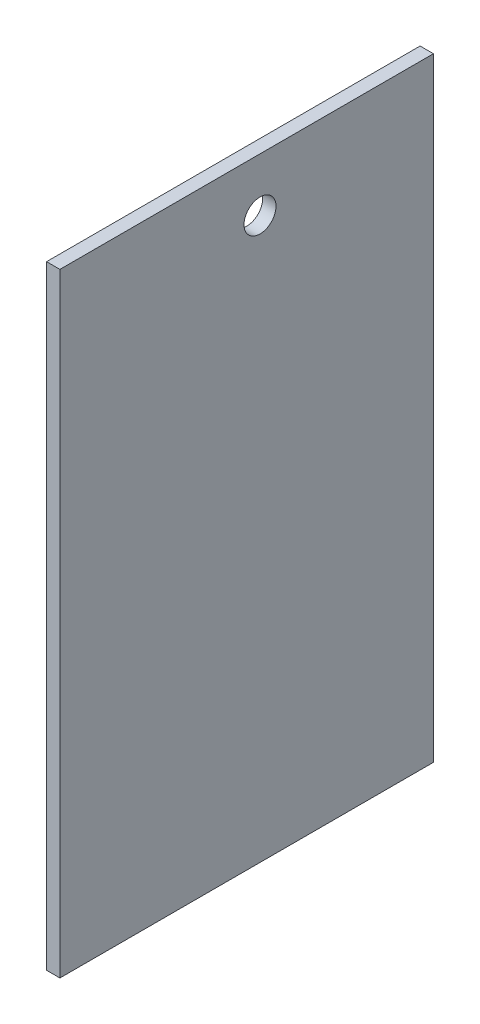
ISO-10303-21;
HEADER;
FILE_DESCRIPTION(('STEP AP214'),'2;1');
FILE_NAME('part.step','',(''),(''),'','','');
FILE_SCHEMA(('AUTOMOTIVE_DESIGN { 1 0 10303 214 1 1 1 1 }'));
ENDSEC;
DATA;
#1=APPLICATION_CONTEXT('core data for automotive mechanical design processes');
#2=APPLICATION_PROTOCOL_DEFINITION('international standard','automotive_design',2000,#1);
#3=PRODUCT_CONTEXT('',#1,'mechanical');
#4=PRODUCT('Part','Part','',(#3));
#5=PRODUCT_RELATED_PRODUCT_CATEGORY('part','',(#4));
#6=PRODUCT_DEFINITION_FORMATION('','',#4);
#7=PRODUCT_DEFINITION_CONTEXT('part definition',#1,'design');
#8=PRODUCT_DEFINITION('design','',#6,#7);
#9=PRODUCT_DEFINITION_SHAPE('','',#8);
#10=(LENGTH_UNIT() NAMED_UNIT(*) SI_UNIT(.MILLI.,.METRE.));
#11=(NAMED_UNIT(*) PLANE_ANGLE_UNIT() SI_UNIT($,.RADIAN.));
#12=(NAMED_UNIT(*) SI_UNIT($,.STERADIAN.) SOLID_ANGLE_UNIT());
#13=UNCERTAINTY_MEASURE_WITH_UNIT(LENGTH_MEASURE(1.E-05),#10,'distance_accuracy_value','');
#14=(GEOMETRIC_REPRESENTATION_CONTEXT(3) GLOBAL_UNCERTAINTY_ASSIGNED_CONTEXT((#13)) GLOBAL_UNIT_ASSIGNED_CONTEXT((#10,
#11,#12)) REPRESENTATION_CONTEXT('',''));
#15=CARTESIAN_POINT('',(0.,0.,0.));
#16=DIRECTION('',(0.,0.,1.));
#17=DIRECTION('',(1.,0.,0.));
#18=AXIS2_PLACEMENT_3D('',#15,#16,#17);
#19=CARTESIAN_POINT('',(3.175,73.025,-44.45));
#20=DIRECTION('',(0.,0.,1.));
#21=DIRECTION('',(0.,-1.,0.));
#22=AXIS2_PLACEMENT_3D('',#19,#20,#21);
#23=PLANE('',#22);
#24=DIRECTION('',(0.,1.,0.));
#25=VECTOR('',#24,1.);
#26=CARTESIAN_POINT('',(0.,73.025,-44.45));
#27=LINE('',#26,#25);
#28=CARTESIAN_POINT('',(0.,-73.025,-44.45));
#29=VERTEX_POINT('',#28);
#30=CARTESIAN_POINT('',(0.,73.025,-44.45));
#31=VERTEX_POINT('',#30);
#32=EDGE_CURVE('E103',#29,#31,#27,.T.);
#33=ORIENTED_EDGE('',*,*,#32,.T.);
#34=DIRECTION('',(-1.,0.,0.));
#35=VECTOR('',#34,1.);
#36=CARTESIAN_POINT('',(3.175,73.025,-44.45));
#37=LINE('',#36,#35);
#38=CARTESIAN_POINT('',(3.175,73.025,-44.45));
#39=VERTEX_POINT('',#38);
#40=EDGE_CURVE('E11',#39,#31,#37,.T.);
#41=ORIENTED_EDGE('',*,*,#40,.F.);
#42=DIRECTION('',(0.,1.,0.));
#43=VECTOR('',#42,1.);
#44=CARTESIAN_POINT('',(3.175,73.025,-44.45));
#45=LINE('',#44,#43);
#46=CARTESIAN_POINT('',(3.175,-73.025,-44.45));
#47=VERTEX_POINT('',#46);
#48=EDGE_CURVE('E91',#47,#39,#45,.T.);
#49=ORIENTED_EDGE('',*,*,#48,.F.);
#50=DIRECTION('',(-1.,0.,0.));
#51=VECTOR('',#50,1.);
#52=CARTESIAN_POINT('',(3.175,-73.025,-44.45));
#53=LINE('',#52,#51);
#54=EDGE_CURVE('E99',#47,#29,#53,.T.);
#55=ORIENTED_EDGE('',*,*,#54,.T.);
#56=EDGE_LOOP('',(#33,#41,#49,#55));
#57=FACE_BOUND('',#56,.T.);
#58=ADVANCED_FACE('F40',(#57),#23,.F.);
#59=CARTESIAN_POINT('',(3.175,73.025,44.45));
#60=DIRECTION('',(0.,-1.,0.));
#61=DIRECTION('',(0.,0.,-1.));
#62=AXIS2_PLACEMENT_3D('',#59,#60,#61);
#63=PLANE('',#62);
#64=DIRECTION('',(0.,0.,1.));
#65=VECTOR('',#64,1.);
#66=CARTESIAN_POINT('',(0.,73.025,44.45));
#67=LINE('',#66,#65);
#68=CARTESIAN_POINT('',(0.,73.025,44.45));
#69=VERTEX_POINT('',#68);
#70=EDGE_CURVE('E95',#31,#69,#67,.T.);
#71=ORIENTED_EDGE('',*,*,#70,.T.);
#72=DIRECTION('',(-1.,0.,0.));
#73=VECTOR('',#72,1.);
#74=CARTESIAN_POINT('',(3.175,73.025,44.45));
#75=LINE('',#74,#73);
#76=CARTESIAN_POINT('',(3.175,73.025,44.45));
#77=VERTEX_POINT('',#76);
#78=EDGE_CURVE('E48',#77,#69,#75,.T.);
#79=ORIENTED_EDGE('',*,*,#78,.F.);
#80=DIRECTION('',(0.,0.,1.));
#81=VECTOR('',#80,1.);
#82=CARTESIAN_POINT('',(3.175,73.025,44.45));
#83=LINE('',#82,#81);
#84=EDGE_CURVE('E86',#39,#77,#83,.T.);
#85=ORIENTED_EDGE('',*,*,#84,.F.);
#86=ORIENTED_EDGE('',*,*,#40,.T.);
#87=EDGE_LOOP('',(#71,#79,#85,#86));
#88=FACE_BOUND('',#87,.T.);
#89=ADVANCED_FACE('F94',(#88),#63,.F.);
#90=CARTESIAN_POINT('',(3.175,73.025,44.45));
#91=DIRECTION('',(0.,0.,-1.));
#92=DIRECTION('',(0.,1.,0.));
#93=AXIS2_PLACEMENT_3D('',#90,#91,#92);
#94=PLANE('',#93);
#95=DIRECTION('',(0.,-1.,0.));
#96=VECTOR('',#95,1.);
#97=CARTESIAN_POINT('',(0.,73.025,44.45));
#98=LINE('',#97,#96);
#99=CARTESIAN_POINT('',(0.,-73.025,44.45));
#100=VERTEX_POINT('',#99);
#101=EDGE_CURVE('E73',#69,#100,#98,.T.);
#102=ORIENTED_EDGE('',*,*,#101,.T.);
#103=DIRECTION('',(-1.,0.,0.));
#104=VECTOR('',#103,1.);
#105=CARTESIAN_POINT('',(3.175,-73.025,44.45));
#106=LINE('',#105,#104);
#107=CARTESIAN_POINT('',(3.175,-73.025,44.45));
#108=VERTEX_POINT('',#107);
#109=EDGE_CURVE('E96',#108,#100,#106,.T.);
#110=ORIENTED_EDGE('',*,*,#109,.F.);
#111=DIRECTION('',(0.,-1.,0.));
#112=VECTOR('',#111,1.);
#113=CARTESIAN_POINT('',(3.175,73.025,44.45));
#114=LINE('',#113,#112);
#115=EDGE_CURVE('E89',#77,#108,#114,.T.);
#116=ORIENTED_EDGE('',*,*,#115,.F.);
#117=ORIENTED_EDGE('',*,*,#78,.T.);
#118=EDGE_LOOP('',(#102,#110,#116,#117));
#119=FACE_BOUND('',#118,.T.);
#120=ADVANCED_FACE('F97',(#119),#94,.F.);
#121=CARTESIAN_POINT('',(3.175,-73.025,44.45));
#122=DIRECTION('',(0.,1.,0.));
#123=DIRECTION('',(0.,0.,1.));
#124=AXIS2_PLACEMENT_3D('',#121,#122,#123);
#125=PLANE('',#124);
#126=DIRECTION('',(0.,0.,-1.));
#127=VECTOR('',#126,1.);
#128=CARTESIAN_POINT('',(0.,-73.025,44.45));
#129=LINE('',#128,#127);
#130=EDGE_CURVE('E79',#100,#29,#129,.T.);
#131=ORIENTED_EDGE('',*,*,#130,.T.);
#132=ORIENTED_EDGE('',*,*,#54,.F.);
#133=DIRECTION('',(0.,0.,-1.));
#134=VECTOR('',#133,1.);
#135=CARTESIAN_POINT('',(3.175,-73.025,44.45));
#136=LINE('',#135,#134);
#137=EDGE_CURVE('E56',#108,#47,#136,.T.);
#138=ORIENTED_EDGE('',*,*,#137,.F.);
#139=ORIENTED_EDGE('',*,*,#109,.T.);
#140=EDGE_LOOP('',(#131,#132,#138,#139));
#141=FACE_BOUND('',#140,.T.);
#142=ADVANCED_FACE('F111',(#141),#125,.F.);
#143=CARTESIAN_POINT('',(3.175,0.,0.));
#144=DIRECTION('',(1.,0.,0.));
#145=DIRECTION('',(0.,0.,-1.));
#146=AXIS2_PLACEMENT_3D('',#143,#144,#145);
#147=PLANE('',#146);
#148=CARTESIAN_POINT('',(3.175,60.325,-3.17499999999999));
#149=DIRECTION('',(1.,0.,0.));
#150=DIRECTION('',(0.,0.,-1.));
#151=AXIS2_PLACEMENT_3D('',#148,#149,#150);
#152=CIRCLE('',#151,3.81);
#153=CARTESIAN_POINT('',(3.175,60.325,-6.98499999999999));
#154=VERTEX_POINT('',#153);
#155=EDGE_CURVE('E117',#154,#154,#152,.T.);
#156=ORIENTED_EDGE('',*,*,#155,.F.);
#157=EDGE_LOOP('',(#156));
#158=FACE_BOUND('',#157,.T.);
#159=ORIENTED_EDGE('',*,*,#48,.T.);
#160=ORIENTED_EDGE('',*,*,#84,.T.);
#161=ORIENTED_EDGE('',*,*,#115,.T.);
#162=ORIENTED_EDGE('',*,*,#137,.T.);
#163=EDGE_LOOP('',(#159,#160,#161,#162));
#164=FACE_BOUND('',#163,.T.);
#165=ADVANCED_FACE('F87',(#158,#164),#147,.T.);
#166=CARTESIAN_POINT('',(0.,0.,0.));
#167=DIRECTION('',(1.,0.,0.));
#168=DIRECTION('',(0.,0.,-1.));
#169=AXIS2_PLACEMENT_3D('',#166,#167,#168);
#170=PLANE('',#169);
#171=CARTESIAN_POINT('',(0.,60.325,-3.17499999999999));
#172=DIRECTION('',(1.,0.,0.));
#173=DIRECTION('',(0.,0.,-1.));
#174=AXIS2_PLACEMENT_3D('',#171,#172,#173);
#175=CIRCLE('',#174,3.81);
#176=CARTESIAN_POINT('',(0.,60.325,-6.98499999999999));
#177=VERTEX_POINT('',#176);
#178=EDGE_CURVE('E106',#177,#177,#175,.T.);
#179=ORIENTED_EDGE('',*,*,#178,.T.);
#180=EDGE_LOOP('',(#179));
#181=FACE_BOUND('',#180,.T.);
#182=ORIENTED_EDGE('',*,*,#32,.F.);
#183=ORIENTED_EDGE('',*,*,#130,.F.);
#184=ORIENTED_EDGE('',*,*,#101,.F.);
#185=ORIENTED_EDGE('',*,*,#70,.F.);
#186=EDGE_LOOP('',(#182,#183,#184,#185));
#187=FACE_BOUND('',#186,.T.);
#188=ADVANCED_FACE('F114',(#181,#187),#170,.F.);
#189=CARTESIAN_POINT('',(0.,60.325,-3.17499999999999));
#190=DIRECTION('',(1.,0.,0.));
#191=DIRECTION('',(0.,0.,-1.));
#192=AXIS2_PLACEMENT_3D('',#189,#190,#191);
#193=CYLINDRICAL_SURFACE('',#192,3.81);
#194=ORIENTED_EDGE('',*,*,#178,.F.);
#195=EDGE_LOOP('',(#194));
#196=FACE_BOUND('',#195,.T.);
#197=ORIENTED_EDGE('',*,*,#155,.T.);
#198=EDGE_LOOP('',(#197));
#199=FACE_BOUND('',#198,.T.);
#200=ADVANCED_FACE('F124',(#196,#199),#193,.F.);
#201=CLOSED_SHELL('',(#58,#89,#120,#142,#165,#188,#200));
#202=MANIFOLD_SOLID_BREP('B2',#201);
#203=ADVANCED_BREP_SHAPE_REPRESENTATION('',(#18,#202),#14);
#204=SHAPE_DEFINITION_REPRESENTATION(#9,#203);
ENDSEC;
END-ISO-10303-21;
